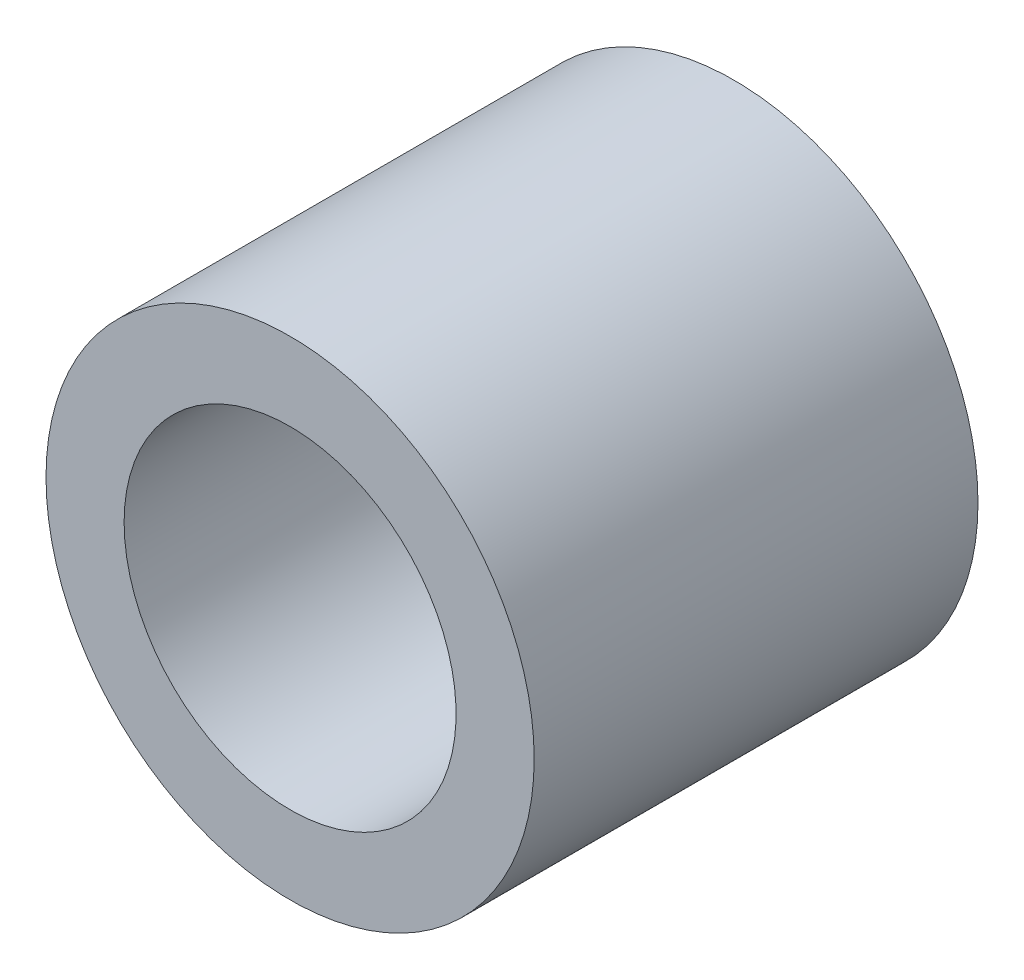
ISO-10303-21;
HEADER;
FILE_DESCRIPTION(('STEP AP214'),'2;1');
FILE_NAME('part.step','',(''),(''),'','','');
FILE_SCHEMA(('AUTOMOTIVE_DESIGN { 1 0 10303 214 1 1 1 1 }'));
ENDSEC;
DATA;
#1=APPLICATION_CONTEXT('core data for automotive mechanical design processes');
#2=APPLICATION_PROTOCOL_DEFINITION('international standard','automotive_design',2000,#1);
#3=PRODUCT_CONTEXT('',#1,'mechanical');
#4=PRODUCT('Part','Part','',(#3));
#5=PRODUCT_RELATED_PRODUCT_CATEGORY('part','',(#4));
#6=PRODUCT_DEFINITION_FORMATION('','',#4);
#7=PRODUCT_DEFINITION_CONTEXT('part definition',#1,'design');
#8=PRODUCT_DEFINITION('design','',#6,#7);
#9=PRODUCT_DEFINITION_SHAPE('','',#8);
#10=(LENGTH_UNIT() NAMED_UNIT(*) SI_UNIT(.MILLI.,.METRE.));
#11=(NAMED_UNIT(*) PLANE_ANGLE_UNIT() SI_UNIT($,.RADIAN.));
#12=(NAMED_UNIT(*) SI_UNIT($,.STERADIAN.) SOLID_ANGLE_UNIT());
#13=UNCERTAINTY_MEASURE_WITH_UNIT(LENGTH_MEASURE(1.E-05),#10,'distance_accuracy_value','');
#14=(GEOMETRIC_REPRESENTATION_CONTEXT(3) GLOBAL_UNCERTAINTY_ASSIGNED_CONTEXT((#13)) GLOBAL_UNIT_ASSIGNED_CONTEXT((#10,
#11,#12)) REPRESENTATION_CONTEXT('',''));
#15=CARTESIAN_POINT('',(0.,0.,0.));
#16=DIRECTION('',(0.,0.,1.));
#17=DIRECTION('',(1.,0.,0.));
#18=AXIS2_PLACEMENT_3D('',#15,#16,#17);
#19=CARTESIAN_POINT('',(29.464,-5.6515,-15.875));
#20=DIRECTION('',(0.,0.,-1.));
#21=DIRECTION('',(0.,-1.,0.));
#22=AXIS2_PLACEMENT_3D('',#19,#20,#21);
#23=PLANE('',#22);
#24=CARTESIAN_POINT('',(29.464,-17.526,-15.875));
#25=DIRECTION('',(0.,0.,-1.));
#26=DIRECTION('',(-1.,0.,0.));
#27=AXIS2_PLACEMENT_3D('',#24,#25,#26);
#28=CIRCLE('',#27,11.8745);
#29=CARTESIAN_POINT('',(17.5895,-17.526,-15.875));
#30=VERTEX_POINT('',#29);
#31=EDGE_CURVE('E10',#30,#30,#28,.T.);
#32=ORIENTED_EDGE('',*,*,#31,.F.);
#33=EDGE_LOOP('',(#32));
#34=FACE_BOUND('',#33,.T.);
#35=CARTESIAN_POINT('',(29.464,-17.526,-15.875));
#36=DIRECTION('',(0.,0.,-1.));
#37=DIRECTION('',(-1.,0.,0.));
#38=AXIS2_PLACEMENT_3D('',#35,#36,#37);
#39=CIRCLE('',#38,17.4625);
#40=CARTESIAN_POINT('',(12.0015,-17.526,-15.875));
#41=VERTEX_POINT('',#40);
#42=EDGE_CURVE('E64',#41,#41,#39,.T.);
#43=ORIENTED_EDGE('',*,*,#42,.T.);
#44=EDGE_LOOP('',(#43));
#45=FACE_BOUND('',#44,.T.);
#46=ADVANCED_FACE('F47',(#34,#45),#23,.T.);
#47=CARTESIAN_POINT('',(29.464,-0.0635000000000063,15.875));
#48=DIRECTION('',(0.,0.,1.));
#49=DIRECTION('',(1.,0.,0.));
#50=AXIS2_PLACEMENT_3D('',#47,#48,#49);
#51=PLANE('',#50);
#52=CARTESIAN_POINT('',(29.464,-17.526,15.875));
#53=DIRECTION('',(0.,0.,-1.));
#54=DIRECTION('',(-1.,0.,0.));
#55=AXIS2_PLACEMENT_3D('',#52,#53,#54);
#56=CIRCLE('',#55,11.8745);
#57=CARTESIAN_POINT('',(17.5895,-17.526,15.875));
#58=VERTEX_POINT('',#57);
#59=EDGE_CURVE('E50',#58,#58,#56,.T.);
#60=ORIENTED_EDGE('',*,*,#59,.T.);
#61=EDGE_LOOP('',(#60));
#62=FACE_BOUND('',#61,.T.);
#63=CARTESIAN_POINT('',(29.464,-17.526,15.875));
#64=DIRECTION('',(0.,0.,-1.));
#65=DIRECTION('',(-1.,0.,0.));
#66=AXIS2_PLACEMENT_3D('',#63,#64,#65);
#67=CIRCLE('',#66,17.4625);
#68=CARTESIAN_POINT('',(12.0015,-17.526,15.875));
#69=VERTEX_POINT('',#68);
#70=EDGE_CURVE('E62',#69,#69,#67,.T.);
#71=ORIENTED_EDGE('',*,*,#70,.F.);
#72=EDGE_LOOP('',(#71));
#73=FACE_BOUND('',#72,.T.);
#74=ADVANCED_FACE('F74',(#62,#73),#51,.T.);
#75=CARTESIAN_POINT('',(29.464,-17.526,0.));
#76=DIRECTION('',(0.,0.,-1.));
#77=DIRECTION('',(-1.,0.,0.));
#78=AXIS2_PLACEMENT_3D('',#75,#76,#77);
#79=CYLINDRICAL_SURFACE('',#78,11.8745);
#80=ORIENTED_EDGE('',*,*,#31,.T.);
#81=EDGE_LOOP('',(#80));
#82=FACE_BOUND('',#81,.T.);
#83=ORIENTED_EDGE('',*,*,#59,.F.);
#84=EDGE_LOOP('',(#83));
#85=FACE_BOUND('',#84,.T.);
#86=ADVANCED_FACE('F76',(#82,#85),#79,.F.);
#87=CARTESIAN_POINT('',(29.464,-17.526,0.));
#88=DIRECTION('',(0.,0.,-1.));
#89=DIRECTION('',(-1.,0.,0.));
#90=AXIS2_PLACEMENT_3D('',#87,#88,#89);
#91=CYLINDRICAL_SURFACE('',#90,17.4625);
#92=ORIENTED_EDGE('',*,*,#70,.T.);
#93=EDGE_LOOP('',(#92));
#94=FACE_BOUND('',#93,.T.);
#95=ORIENTED_EDGE('',*,*,#42,.F.);
#96=EDGE_LOOP('',(#95));
#97=FACE_BOUND('',#96,.T.);
#98=ADVANCED_FACE('F71',(#94,#97),#91,.T.);
#99=CLOSED_SHELL('',(#46,#74,#86,#98));
#100=MANIFOLD_SOLID_BREP('B2',#99);
#101=ADVANCED_BREP_SHAPE_REPRESENTATION('',(#18,#100),#14);
#102=SHAPE_DEFINITION_REPRESENTATION(#9,#101);
ENDSEC;
END-ISO-10303-21;
